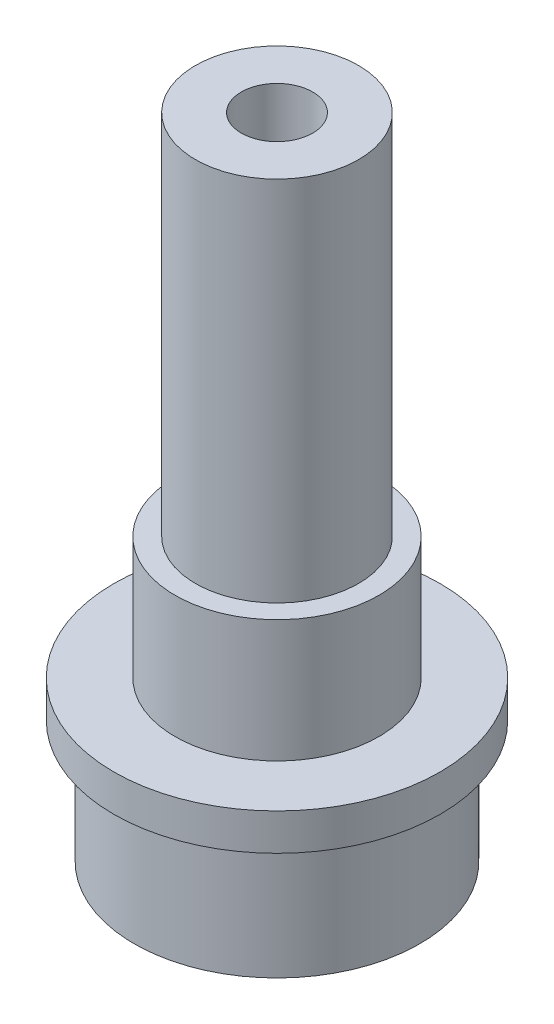
ISO-10303-21;
HEADER;
FILE_DESCRIPTION(('STEP AP214'),'2;1');
FILE_NAME('part.step','',(''),(''),'','','');
FILE_SCHEMA(('AUTOMOTIVE_DESIGN { 1 0 10303 214 1 1 1 1 }'));
ENDSEC;
DATA;
#1=APPLICATION_CONTEXT('core data for automotive mechanical design processes');
#2=APPLICATION_PROTOCOL_DEFINITION('international standard','automotive_design',2000,#1);
#3=PRODUCT_CONTEXT('',#1,'mechanical');
#4=PRODUCT('Part','Part','',(#3));
#5=PRODUCT_RELATED_PRODUCT_CATEGORY('part','',(#4));
#6=PRODUCT_DEFINITION_FORMATION('','',#4);
#7=PRODUCT_DEFINITION_CONTEXT('part definition',#1,'design');
#8=PRODUCT_DEFINITION('design','',#6,#7);
#9=PRODUCT_DEFINITION_SHAPE('','',#8);
#10=(LENGTH_UNIT() NAMED_UNIT(*) SI_UNIT(.MILLI.,.METRE.));
#11=(NAMED_UNIT(*) PLANE_ANGLE_UNIT() SI_UNIT($,.RADIAN.));
#12=(NAMED_UNIT(*) SI_UNIT($,.STERADIAN.) SOLID_ANGLE_UNIT());
#13=UNCERTAINTY_MEASURE_WITH_UNIT(LENGTH_MEASURE(1.E-05),#10,'distance_accuracy_value','');
#14=(GEOMETRIC_REPRESENTATION_CONTEXT(3) GLOBAL_UNCERTAINTY_ASSIGNED_CONTEXT((#13)) GLOBAL_UNIT_ASSIGNED_CONTEXT((#10,
#11,#12)) REPRESENTATION_CONTEXT('',''));
#15=CARTESIAN_POINT('',(0.,0.,0.));
#16=DIRECTION('',(0.,0.,1.));
#17=DIRECTION('',(1.,0.,0.));
#18=AXIS2_PLACEMENT_3D('',#15,#16,#17);
#19=CARTESIAN_POINT('',(0.,100.,0.));
#20=DIRECTION('',(0.,-1.,0.));
#21=DIRECTION('',(0.,0.,-1.));
#22=AXIS2_PLACEMENT_3D('',#19,#20,#21);
#23=PLANE('',#22);
#24=CARTESIAN_POINT('',(0.,100.,0.));
#25=DIRECTION('',(0.,-1.,0.));
#26=DIRECTION('',(0.,0.,-1.));
#27=AXIS2_PLACEMENT_3D('',#24,#25,#26);
#28=CIRCLE('',#27,15.);
#29=CARTESIAN_POINT('',(0.,100.,-15.));
#30=VERTEX_POINT('',#29);
#31=EDGE_CURVE('E19',#30,#30,#28,.T.);
#32=ORIENTED_EDGE('',*,*,#31,.T.);
#33=EDGE_LOOP('',(#32));
#34=FACE_BOUND('',#33,.T.);
#35=ADVANCED_FACE('F16',(#34),#23,.T.);
#36=CARTESIAN_POINT('',(0.,100.,0.));
#37=DIRECTION('',(0.,-1.,0.));
#38=DIRECTION('',(0.,0.,-1.));
#39=AXIS2_PLACEMENT_3D('',#36,#37,#38);
#40=CYLINDRICAL_SURFACE('',#39,15.);
#41=ORIENTED_EDGE('',*,*,#31,.F.);
#42=EDGE_LOOP('',(#41));
#43=FACE_BOUND('',#42,.T.);
#44=CARTESIAN_POINT('',(0.,0.,0.));
#45=DIRECTION('',(0.,-1.,0.));
#46=DIRECTION('',(0.,0.,-1.));
#47=AXIS2_PLACEMENT_3D('',#44,#45,#46);
#48=CIRCLE('',#47,15.);
#49=CARTESIAN_POINT('',(0.,0.,-15.));
#50=VERTEX_POINT('',#49);
#51=EDGE_CURVE('E61',#50,#50,#48,.T.);
#52=ORIENTED_EDGE('',*,*,#51,.T.);
#53=EDGE_LOOP('',(#52));
#54=FACE_BOUND('',#53,.T.);
#55=ADVANCED_FACE('F69',(#43,#54),#40,.F.);
#56=CARTESIAN_POINT('',(0.,0.,0.));
#57=DIRECTION('',(0.,1.,0.));
#58=DIRECTION('',(0.,0.,1.));
#59=AXIS2_PLACEMENT_3D('',#56,#57,#58);
#60=PLANE('',#59);
#61=CARTESIAN_POINT('',(0.,0.,0.));
#62=DIRECTION('',(0.,-1.,0.));
#63=DIRECTION('',(0.,0.,-1.));
#64=AXIS2_PLACEMENT_3D('',#61,#62,#63);
#65=CIRCLE('',#64,35.);
#66=CARTESIAN_POINT('',(0.,0.,-35.));
#67=VERTEX_POINT('',#66);
#68=EDGE_CURVE('E59',#67,#67,#65,.F.);
#69=ORIENTED_EDGE('',*,*,#68,.F.);
#70=EDGE_LOOP('',(#69));
#71=FACE_BOUND('',#70,.T.);
#72=ORIENTED_EDGE('',*,*,#51,.F.);
#73=EDGE_LOOP('',(#72));
#74=FACE_BOUND('',#73,.T.);
#75=ADVANCED_FACE('F71',(#71,#74),#60,.F.);
#76=CARTESIAN_POINT('',(0.,30.,0.));
#77=DIRECTION('',(0.,-1.,0.));
#78=DIRECTION('',(0.,0.,-1.));
#79=AXIS2_PLACEMENT_3D('',#76,#77,#78);
#80=CYLINDRICAL_SURFACE('',#79,35.);
#81=CARTESIAN_POINT('',(0.,30.,0.));
#82=DIRECTION('',(0.,-1.,0.));
#83=DIRECTION('',(0.,0.,-1.));
#84=AXIS2_PLACEMENT_3D('',#81,#82,#83);
#85=CIRCLE('',#84,35.);
#86=CARTESIAN_POINT('',(0.,30.,-35.));
#87=VERTEX_POINT('',#86);
#88=EDGE_CURVE('E56',#87,#87,#85,.T.);
#89=ORIENTED_EDGE('',*,*,#88,.T.);
#90=EDGE_LOOP('',(#89));
#91=FACE_BOUND('',#90,.T.);
#92=ORIENTED_EDGE('',*,*,#68,.T.);
#93=EDGE_LOOP('',(#92));
#94=FACE_BOUND('',#93,.T.);
#95=ADVANCED_FACE('F78',(#91,#94),#80,.T.);
#96=CARTESIAN_POINT('',(0.,30.,0.));
#97=DIRECTION('',(0.,1.,0.));
#98=DIRECTION('',(0.,0.,1.));
#99=AXIS2_PLACEMENT_3D('',#96,#97,#98);
#100=PLANE('',#99);
#101=ORIENTED_EDGE('',*,*,#88,.F.);
#102=EDGE_LOOP('',(#101));
#103=FACE_BOUND('',#102,.T.);
#104=CARTESIAN_POINT('',(0.,30.,0.));
#105=DIRECTION('',(0.,-1.,0.));
#106=DIRECTION('',(0.,0.,-1.));
#107=AXIS2_PLACEMENT_3D('',#104,#105,#106);
#108=CIRCLE('',#107,40.);
#109=CARTESIAN_POINT('',(0.,30.,-40.));
#110=VERTEX_POINT('',#109);
#111=EDGE_CURVE('E44',#110,#110,#108,.F.);
#112=ORIENTED_EDGE('',*,*,#111,.F.);
#113=EDGE_LOOP('',(#112));
#114=FACE_BOUND('',#113,.T.);
#115=ADVANCED_FACE('F111',(#103,#114),#100,.F.);
#116=CARTESIAN_POINT('',(0.,39.,0.));
#117=DIRECTION('',(0.,-1.,0.));
#118=DIRECTION('',(0.,0.,-1.));
#119=AXIS2_PLACEMENT_3D('',#116,#117,#118);
#120=CYLINDRICAL_SURFACE('',#119,40.);
#121=ORIENTED_EDGE('',*,*,#111,.T.);
#122=EDGE_LOOP('',(#121));
#123=FACE_BOUND('',#122,.T.);
#124=CARTESIAN_POINT('',(0.,39.,0.));
#125=DIRECTION('',(0.,-1.,0.));
#126=DIRECTION('',(0.,0.,-1.));
#127=AXIS2_PLACEMENT_3D('',#124,#125,#126);
#128=CIRCLE('',#127,40.);
#129=CARTESIAN_POINT('',(0.,39.,-40.));
#130=VERTEX_POINT('',#129);
#131=EDGE_CURVE('E38',#130,#130,#128,.F.);
#132=ORIENTED_EDGE('',*,*,#131,.F.);
#133=EDGE_LOOP('',(#132));
#134=FACE_BOUND('',#133,.T.);
#135=ADVANCED_FACE('F31',(#123,#134),#120,.T.);
#136=CARTESIAN_POINT('',(0.,129.,0.));
#137=DIRECTION('',(0.,1.,0.));
#138=DIRECTION('',(0.,0.,1.));
#139=AXIS2_PLACEMENT_3D('',#136,#137,#138);
#140=CONICAL_SURFACE('',#139,8.75,1.02974425867665);
#141=CARTESIAN_POINT('',(0.,123.742469583509,0.));
#142=VERTEX_POINT('',#141);
#143=VERTEX_LOOP('',#142);
#144=FACE_BOUND('',#143,.T.);
#145=CARTESIAN_POINT('',(0.,129.,0.));
#146=DIRECTION('',(0.,1.,0.));
#147=DIRECTION('',(0.,0.,1.));
#148=AXIS2_PLACEMENT_3D('',#145,#146,#147);
#149=CIRCLE('',#148,8.75);
#150=CARTESIAN_POINT('',(0.,129.,8.75));
#151=VERTEX_POINT('',#150);
#152=EDGE_CURVE('E35',#151,#151,#149,.T.);
#153=ORIENTED_EDGE('',*,*,#152,.T.);
#154=EDGE_LOOP('',(#153));
#155=FACE_BOUND('',#154,.T.);
#156=ADVANCED_FACE('F27',(#144,#155),#140,.F.);
#157=CARTESIAN_POINT('',(0.,39.,0.));
#158=DIRECTION('',(0.,1.,0.));
#159=DIRECTION('',(0.,0.,1.));
#160=AXIS2_PLACEMENT_3D('',#157,#158,#159);
#161=PLANE('',#160);
#162=CARTESIAN_POINT('',(0.,39.,0.));
#163=DIRECTION('',(0.,-1.,0.));
#164=DIRECTION('',(0.,0.,-1.));
#165=AXIS2_PLACEMENT_3D('',#162,#163,#164);
#166=CIRCLE('',#165,25.);
#167=CARTESIAN_POINT('',(0.,39.,-25.));
#168=VERTEX_POINT('',#167);
#169=EDGE_CURVE('E37',#168,#168,#166,.F.);
#170=ORIENTED_EDGE('',*,*,#169,.F.);
#171=EDGE_LOOP('',(#170));
#172=FACE_BOUND('',#171,.T.);
#173=ORIENTED_EDGE('',*,*,#131,.T.);
#174=EDGE_LOOP('',(#173));
#175=FACE_BOUND('',#174,.T.);
#176=ADVANCED_FACE('F30',(#172,#175),#161,.T.);
#177=CARTESIAN_POINT('',(0.,159.,0.));
#178=DIRECTION('',(0.,1.,0.));
#179=DIRECTION('',(0.,0.,1.));
#180=AXIS2_PLACEMENT_3D('',#177,#178,#179);
#181=CYLINDRICAL_SURFACE('',#180,8.75);
#182=CARTESIAN_POINT('',(0.,159.,0.));
#183=DIRECTION('',(0.,1.,0.));
#184=DIRECTION('',(0.,0.,1.));
#185=AXIS2_PLACEMENT_3D('',#182,#183,#184);
#186=CIRCLE('',#185,8.75);
#187=CARTESIAN_POINT('',(0.,159.,8.75));
#188=VERTEX_POINT('',#187);
#189=EDGE_CURVE('E41',#188,#188,#186,.F.);
#190=ORIENTED_EDGE('',*,*,#189,.F.);
#191=EDGE_LOOP('',(#190));
#192=FACE_BOUND('',#191,.T.);
#193=ORIENTED_EDGE('',*,*,#152,.F.);
#194=EDGE_LOOP('',(#193));
#195=FACE_BOUND('',#194,.T.);
#196=ADVANCED_FACE('F101',(#192,#195),#181,.F.);
#197=CARTESIAN_POINT('',(0.,69.,0.));
#198=DIRECTION('',(0.,-1.,0.));
#199=DIRECTION('',(0.,0.,-1.));
#200=AXIS2_PLACEMENT_3D('',#197,#198,#199);
#201=CYLINDRICAL_SURFACE('',#200,25.);
#202=ORIENTED_EDGE('',*,*,#169,.T.);
#203=EDGE_LOOP('',(#202));
#204=FACE_BOUND('',#203,.T.);
#205=CARTESIAN_POINT('',(0.,69.,0.));
#206=DIRECTION('',(0.,-1.,0.));
#207=DIRECTION('',(0.,0.,-1.));
#208=AXIS2_PLACEMENT_3D('',#205,#206,#207);
#209=CIRCLE('',#208,25.);
#210=CARTESIAN_POINT('',(0.,69.,-25.));
#211=VERTEX_POINT('',#210);
#212=EDGE_CURVE('E49',#211,#211,#209,.F.);
#213=ORIENTED_EDGE('',*,*,#212,.F.);
#214=EDGE_LOOP('',(#213));
#215=FACE_BOUND('',#214,.T.);
#216=ADVANCED_FACE('F97',(#204,#215),#201,.T.);
#217=CARTESIAN_POINT('',(0.,159.,0.));
#218=DIRECTION('',(0.,1.,0.));
#219=DIRECTION('',(0.,0.,1.));
#220=AXIS2_PLACEMENT_3D('',#217,#218,#219);
#221=PLANE('',#220);
#222=CARTESIAN_POINT('',(0.,159.,0.));
#223=DIRECTION('',(0.,-1.,0.));
#224=DIRECTION('',(0.,0.,-1.));
#225=AXIS2_PLACEMENT_3D('',#222,#223,#224);
#226=CIRCLE('',#225,20.);
#227=CARTESIAN_POINT('',(0.,159.,-20.));
#228=VERTEX_POINT('',#227);
#229=EDGE_CURVE('E23',#228,#228,#226,.T.);
#230=ORIENTED_EDGE('',*,*,#229,.F.);
#231=EDGE_LOOP('',(#230));
#232=FACE_BOUND('',#231,.T.);
#233=ORIENTED_EDGE('',*,*,#189,.T.);
#234=EDGE_LOOP('',(#233));
#235=FACE_BOUND('',#234,.T.);
#236=ADVANCED_FACE('F90',(#232,#235),#221,.T.);
#237=CARTESIAN_POINT('',(0.,69.,0.));
#238=DIRECTION('',(0.,1.,0.));
#239=DIRECTION('',(0.,0.,1.));
#240=AXIS2_PLACEMENT_3D('',#237,#238,#239);
#241=PLANE('',#240);
#242=CARTESIAN_POINT('',(0.,69.,0.));
#243=DIRECTION('',(0.,-1.,0.));
#244=DIRECTION('',(0.,0.,-1.));
#245=AXIS2_PLACEMENT_3D('',#242,#243,#244);
#246=CIRCLE('',#245,20.);
#247=CARTESIAN_POINT('',(0.,69.,-20.));
#248=VERTEX_POINT('',#247);
#249=EDGE_CURVE('E11',#248,#248,#246,.F.);
#250=ORIENTED_EDGE('',*,*,#249,.F.);
#251=EDGE_LOOP('',(#250));
#252=FACE_BOUND('',#251,.T.);
#253=ORIENTED_EDGE('',*,*,#212,.T.);
#254=EDGE_LOOP('',(#253));
#255=FACE_BOUND('',#254,.T.);
#256=ADVANCED_FACE('F83',(#252,#255),#241,.T.);
#257=CARTESIAN_POINT('',(0.,159.,0.));
#258=DIRECTION('',(0.,-1.,0.));
#259=DIRECTION('',(0.,0.,-1.));
#260=AXIS2_PLACEMENT_3D('',#257,#258,#259);
#261=CYLINDRICAL_SURFACE('',#260,20.);
#262=ORIENTED_EDGE('',*,*,#249,.T.);
#263=EDGE_LOOP('',(#262));
#264=FACE_BOUND('',#263,.T.);
#265=ORIENTED_EDGE('',*,*,#229,.T.);
#266=EDGE_LOOP('',(#265));
#267=FACE_BOUND('',#266,.T.);
#268=ADVANCED_FACE('F81',(#264,#267),#261,.T.);
#269=CLOSED_SHELL('',(#35,#55,#75,#95,#115,#135,#156,#176,#196,#216,#236,#256,#268));
#270=MANIFOLD_SOLID_BREP('B1',#269);
#271=ADVANCED_BREP_SHAPE_REPRESENTATION('',(#18,#270),#14);
#272=SHAPE_DEFINITION_REPRESENTATION(#9,#271);
ENDSEC;
END-ISO-10303-21;
